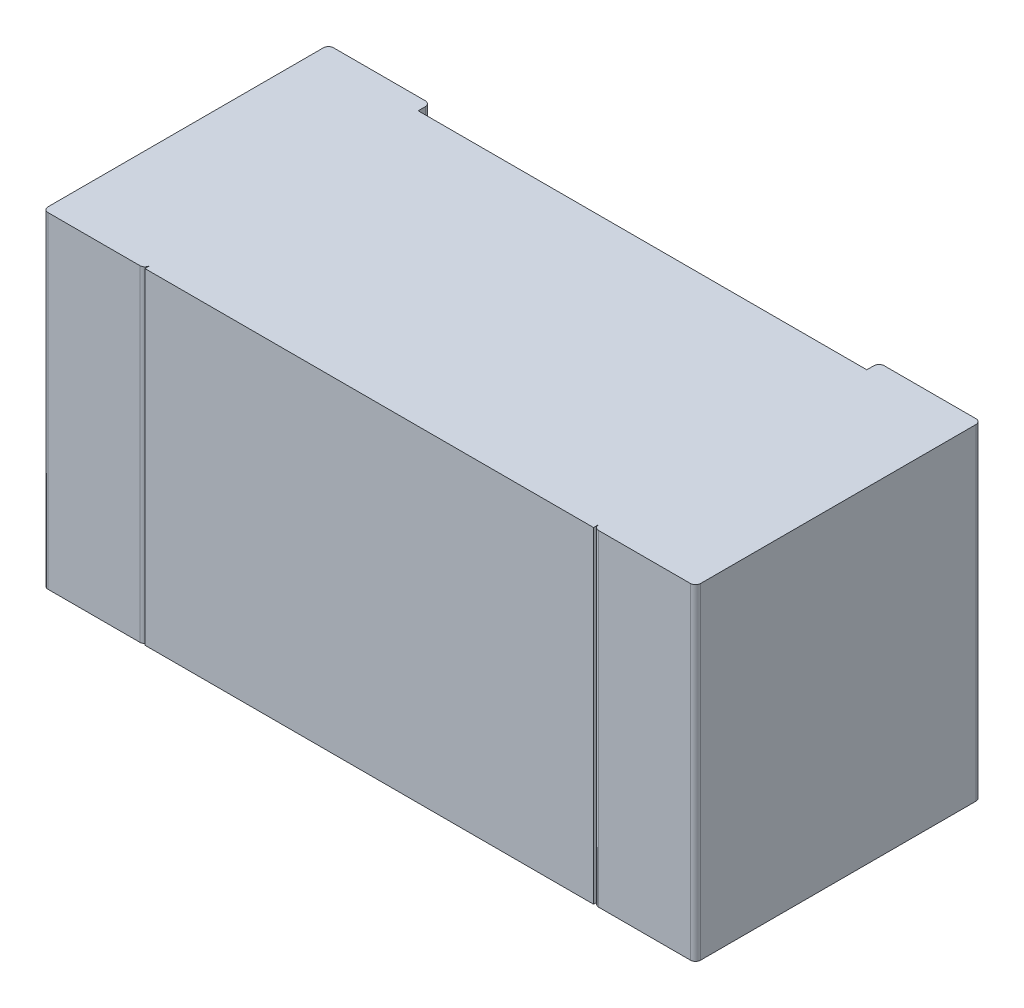
ISO-10303-21;
HEADER;
FILE_DESCRIPTION(('STEP AP214'),'2;1');
FILE_NAME('part.step','',(''),(''),'','','');
FILE_SCHEMA(('AUTOMOTIVE_DESIGN { 1 0 10303 214 1 1 1 1 }'));
ENDSEC;
DATA;
#1=APPLICATION_CONTEXT('core data for automotive mechanical design processes');
#2=APPLICATION_PROTOCOL_DEFINITION('international standard','automotive_design',2000,#1);
#3=PRODUCT_CONTEXT('',#1,'mechanical');
#4=PRODUCT('Part','Part','',(#3));
#5=PRODUCT_RELATED_PRODUCT_CATEGORY('part','',(#4));
#6=PRODUCT_DEFINITION_FORMATION('','',#4);
#7=PRODUCT_DEFINITION_CONTEXT('part definition',#1,'design');
#8=PRODUCT_DEFINITION('design','',#6,#7);
#9=PRODUCT_DEFINITION_SHAPE('','',#8);
#10=(LENGTH_UNIT() NAMED_UNIT(*) SI_UNIT(.MILLI.,.METRE.));
#11=(NAMED_UNIT(*) PLANE_ANGLE_UNIT() SI_UNIT($,.RADIAN.));
#12=(NAMED_UNIT(*) SI_UNIT($,.STERADIAN.) SOLID_ANGLE_UNIT());
#13=UNCERTAINTY_MEASURE_WITH_UNIT(LENGTH_MEASURE(1.E-05),#10,'distance_accuracy_value','');
#14=(GEOMETRIC_REPRESENTATION_CONTEXT(3) GLOBAL_UNCERTAINTY_ASSIGNED_CONTEXT((#13)) GLOBAL_UNIT_ASSIGNED_CONTEXT((#10,
#11,#12)) REPRESENTATION_CONTEXT('',''));
#15=CARTESIAN_POINT('',(0.,0.,0.));
#16=DIRECTION('',(0.,0.,1.));
#17=DIRECTION('',(1.,0.,0.));
#18=AXIS2_PLACEMENT_3D('',#15,#16,#17);
#19=CARTESIAN_POINT('',(-1.6,-0.8,1.4));
#20=DIRECTION('',(0.,0.,1.));
#21=DIRECTION('',(1.,0.,0.));
#22=AXIS2_PLACEMENT_3D('',#19,#20,#21);
#23=PLANE('',#22);
#24=DIRECTION('',(1.,0.,0.));
#25=VECTOR('',#24,1.);
#26=CARTESIAN_POINT('',(-1.6,-0.8,1.4));
#27=LINE('',#26,#25);
#28=CARTESIAN_POINT('',(-1.575,-0.8,1.4));
#29=VERTEX_POINT('',#28);
#30=CARTESIAN_POINT('',(-1.125,-0.8,1.4));
#31=VERTEX_POINT('',#30);
#32=EDGE_CURVE('E162',#29,#31,#27,.T.);
#33=ORIENTED_EDGE('',*,*,#32,.T.);
#34=DIRECTION('',(0.,1.,0.));
#35=VECTOR('',#34,1.);
#36=CARTESIAN_POINT('',(-1.125,-0.8,1.4));
#37=LINE('',#36,#35);
#38=CARTESIAN_POINT('',(-1.125,0.8,1.4));
#39=VERTEX_POINT('',#38);
#40=EDGE_CURVE('E161',#39,#31,#37,.F.);
#41=ORIENTED_EDGE('',*,*,#40,.F.);
#42=DIRECTION('',(1.,0.,0.));
#43=VECTOR('',#42,1.);
#44=CARTESIAN_POINT('',(-1.6,0.8,1.4));
#45=LINE('',#44,#43);
#46=CARTESIAN_POINT('',(-1.575,0.8,1.4));
#47=VERTEX_POINT('',#46);
#48=EDGE_CURVE('E157',#39,#47,#45,.F.);
#49=ORIENTED_EDGE('',*,*,#48,.T.);
#50=DIRECTION('',(0.,1.,0.));
#51=VECTOR('',#50,1.);
#52=CARTESIAN_POINT('',(-1.575,-0.8,1.4));
#53=LINE('',#52,#51);
#54=EDGE_CURVE('E193',#29,#47,#53,.T.);
#55=ORIENTED_EDGE('',*,*,#54,.F.);
#56=EDGE_LOOP('',(#33,#41,#49,#55));
#57=FACE_BOUND('',#56,.T.);
#58=ADVANCED_FACE('F17',(#57),#23,.T.);
#59=CARTESIAN_POINT('',(-1.125,-0.8,1.375));
#60=DIRECTION('',(0.,1.,0.));
#61=DIRECTION('',(0.,0.,1.));
#62=AXIS2_PLACEMENT_3D('',#59,#60,#61);
#63=CYLINDRICAL_SURFACE('',#62,0.025);
#64=ORIENTED_EDGE('',*,*,#40,.T.);
#65=CARTESIAN_POINT('',(-1.125,-0.8,1.375));
#66=DIRECTION('',(0.,1.,0.));
#67=DIRECTION('',(0.,0.,1.));
#68=AXIS2_PLACEMENT_3D('',#65,#66,#67);
#69=CIRCLE('',#68,0.025);
#70=CARTESIAN_POINT('',(-1.1,-0.8,1.375));
#71=VERTEX_POINT('',#70);
#72=EDGE_CURVE('E167',#31,#71,#69,.T.);
#73=ORIENTED_EDGE('',*,*,#72,.T.);
#74=DIRECTION('',(0.,1.,0.));
#75=VECTOR('',#74,1.);
#76=CARTESIAN_POINT('',(-1.1,-0.8,1.375));
#77=LINE('',#76,#75);
#78=CARTESIAN_POINT('',(-1.1,0.8,1.375));
#79=VERTEX_POINT('',#78);
#80=EDGE_CURVE('E164',#71,#79,#77,.T.);
#81=ORIENTED_EDGE('',*,*,#80,.T.);
#82=CARTESIAN_POINT('',(-1.125,0.8,1.375));
#83=DIRECTION('',(0.,1.,0.));
#84=DIRECTION('',(0.,0.,1.));
#85=AXIS2_PLACEMENT_3D('',#82,#83,#84);
#86=CIRCLE('',#85,0.025);
#87=EDGE_CURVE('E20',#79,#39,#86,.F.);
#88=ORIENTED_EDGE('',*,*,#87,.T.);
#89=EDGE_LOOP('',(#64,#73,#81,#88));
#90=FACE_BOUND('',#89,.T.);
#91=ADVANCED_FACE('F165',(#90),#63,.T.);
#92=CARTESIAN_POINT('',(1.125,-0.8,1.375));
#93=DIRECTION('',(0.,1.,0.));
#94=DIRECTION('',(0.,0.,1.));
#95=AXIS2_PLACEMENT_3D('',#92,#93,#94);
#96=CYLINDRICAL_SURFACE('',#95,0.025);
#97=CARTESIAN_POINT('',(1.125,0.8,1.375));
#98=DIRECTION('',(0.,1.,0.));
#99=DIRECTION('',(0.,0.,1.));
#100=AXIS2_PLACEMENT_3D('',#97,#98,#99);
#101=CIRCLE('',#100,0.025);
#102=CARTESIAN_POINT('',(1.125,0.8,1.4));
#103=VERTEX_POINT('',#102);
#104=CARTESIAN_POINT('',(1.1,0.8,1.375));
#105=VERTEX_POINT('',#104);
#106=EDGE_CURVE('E215',#103,#105,#101,.F.);
#107=ORIENTED_EDGE('',*,*,#106,.T.);
#108=DIRECTION('',(0.,1.,0.));
#109=VECTOR('',#108,1.);
#110=CARTESIAN_POINT('',(1.1,-0.8,1.375));
#111=LINE('',#110,#109);
#112=CARTESIAN_POINT('',(1.1,-0.8,1.375));
#113=VERTEX_POINT('',#112);
#114=EDGE_CURVE('E218',#113,#105,#111,.T.);
#115=ORIENTED_EDGE('',*,*,#114,.F.);
#116=CARTESIAN_POINT('',(1.125,-0.8,1.375));
#117=DIRECTION('',(0.,1.,0.));
#118=DIRECTION('',(0.,0.,1.));
#119=AXIS2_PLACEMENT_3D('',#116,#117,#118);
#120=CIRCLE('',#119,0.025);
#121=CARTESIAN_POINT('',(1.125,-0.8,1.4));
#122=VERTEX_POINT('',#121);
#123=EDGE_CURVE('E262',#113,#122,#120,.T.);
#124=ORIENTED_EDGE('',*,*,#123,.T.);
#125=DIRECTION('',(0.,1.,0.));
#126=VECTOR('',#125,1.);
#127=CARTESIAN_POINT('',(1.125,-0.8,1.4));
#128=LINE('',#127,#126);
#129=EDGE_CURVE('E214',#103,#122,#128,.F.);
#130=ORIENTED_EDGE('',*,*,#129,.F.);
#131=EDGE_LOOP('',(#107,#115,#124,#130));
#132=FACE_BOUND('',#131,.T.);
#133=ADVANCED_FACE('F267',(#132),#96,.T.);
#134=CARTESIAN_POINT('',(1.1,-0.8,1.4));
#135=DIRECTION('',(0.,0.,1.));
#136=DIRECTION('',(1.,0.,0.));
#137=AXIS2_PLACEMENT_3D('',#134,#135,#136);
#138=PLANE('',#137);
#139=DIRECTION('',(1.,0.,0.));
#140=VECTOR('',#139,1.);
#141=CARTESIAN_POINT('',(1.1,-0.8,1.4));
#142=LINE('',#141,#140);
#143=CARTESIAN_POINT('',(1.575,-0.8,1.4));
#144=VERTEX_POINT('',#143);
#145=EDGE_CURVE('E209',#122,#144,#142,.T.);
#146=ORIENTED_EDGE('',*,*,#145,.T.);
#147=DIRECTION('',(0.,1.,0.));
#148=VECTOR('',#147,1.);
#149=CARTESIAN_POINT('',(1.575,-0.8,1.4));
#150=LINE('',#149,#148);
#151=CARTESIAN_POINT('',(1.575,0.8,1.4));
#152=VERTEX_POINT('',#151);
#153=EDGE_CURVE('E255',#152,#144,#150,.F.);
#154=ORIENTED_EDGE('',*,*,#153,.F.);
#155=DIRECTION('',(1.,0.,0.));
#156=VECTOR('',#155,1.);
#157=CARTESIAN_POINT('',(1.1,0.8,1.4));
#158=LINE('',#157,#156);
#159=EDGE_CURVE('E212',#152,#103,#158,.F.);
#160=ORIENTED_EDGE('',*,*,#159,.T.);
#161=ORIENTED_EDGE('',*,*,#129,.T.);
#162=EDGE_LOOP('',(#146,#154,#160,#161));
#163=FACE_BOUND('',#162,.T.);
#164=ADVANCED_FACE('F271',(#163),#138,.T.);
#165=CARTESIAN_POINT('',(-1.6,-0.8,0.));
#166=DIRECTION('',(0.,0.,1.));
#167=DIRECTION('',(1.,0.,0.));
#168=AXIS2_PLACEMENT_3D('',#165,#166,#167);
#169=PLANE('',#168);
#170=DIRECTION('',(1.,0.,0.));
#171=VECTOR('',#170,1.);
#172=CARTESIAN_POINT('',(-1.6,-0.8,0.));
#173=LINE('',#172,#171);
#174=CARTESIAN_POINT('',(-1.575,-0.8,0.));
#175=VERTEX_POINT('',#174);
#176=CARTESIAN_POINT('',(-1.125,-0.8,0.));
#177=VERTEX_POINT('',#176);
#178=EDGE_CURVE('E204',#175,#177,#173,.T.);
#179=ORIENTED_EDGE('',*,*,#178,.F.);
#180=DIRECTION('',(0.,1.,0.));
#181=VECTOR('',#180,1.);
#182=CARTESIAN_POINT('',(-1.575,-0.8,0.));
#183=LINE('',#182,#181);
#184=CARTESIAN_POINT('',(-1.575,0.8,0.));
#185=VERTEX_POINT('',#184);
#186=EDGE_CURVE('E197',#185,#175,#183,.F.);
#187=ORIENTED_EDGE('',*,*,#186,.F.);
#188=DIRECTION('',(1.,0.,0.));
#189=VECTOR('',#188,1.);
#190=CARTESIAN_POINT('',(-1.6,0.8,0.));
#191=LINE('',#190,#189);
#192=CARTESIAN_POINT('',(-1.125,0.8,0.));
#193=VERTEX_POINT('',#192);
#194=EDGE_CURVE('E207',#193,#185,#191,.F.);
#195=ORIENTED_EDGE('',*,*,#194,.F.);
#196=DIRECTION('',(0.,1.,0.));
#197=VECTOR('',#196,1.);
#198=CARTESIAN_POINT('',(-1.125,-0.8,0.));
#199=LINE('',#198,#197);
#200=EDGE_CURVE('E188',#177,#193,#199,.T.);
#201=ORIENTED_EDGE('',*,*,#200,.F.);
#202=EDGE_LOOP('',(#179,#187,#195,#201));
#203=FACE_BOUND('',#202,.T.);
#204=ADVANCED_FACE('F442',(#203),#169,.F.);
#205=CARTESIAN_POINT('',(1.1,-0.8,0.));
#206=DIRECTION('',(0.,0.,1.));
#207=DIRECTION('',(1.,0.,0.));
#208=AXIS2_PLACEMENT_3D('',#205,#206,#207);
#209=PLANE('',#208);
#210=DIRECTION('',(1.,0.,0.));
#211=VECTOR('',#210,1.);
#212=CARTESIAN_POINT('',(1.1,-0.8,0.));
#213=LINE('',#212,#211);
#214=CARTESIAN_POINT('',(1.125,-0.8,0.));
#215=VERTEX_POINT('',#214);
#216=CARTESIAN_POINT('',(1.575,-0.8,0.));
#217=VERTEX_POINT('',#216);
#218=EDGE_CURVE('E201',#215,#217,#213,.T.);
#219=ORIENTED_EDGE('',*,*,#218,.F.);
#220=DIRECTION('',(0.,1.,0.));
#221=VECTOR('',#220,1.);
#222=CARTESIAN_POINT('',(1.125,-0.8,0.));
#223=LINE('',#222,#221);
#224=CARTESIAN_POINT('',(1.125,0.8,0.));
#225=VERTEX_POINT('',#224);
#226=EDGE_CURVE('E191',#225,#215,#223,.F.);
#227=ORIENTED_EDGE('',*,*,#226,.F.);
#228=DIRECTION('',(1.,0.,0.));
#229=VECTOR('',#228,1.);
#230=CARTESIAN_POINT('',(1.1,0.8,0.));
#231=LINE('',#230,#229);
#232=CARTESIAN_POINT('',(1.575,0.8,0.));
#233=VERTEX_POINT('',#232);
#234=EDGE_CURVE('E202',#233,#225,#231,.F.);
#235=ORIENTED_EDGE('',*,*,#234,.F.);
#236=DIRECTION('',(0.,1.,0.));
#237=VECTOR('',#236,1.);
#238=CARTESIAN_POINT('',(1.575,-0.8,0.));
#239=LINE('',#238,#237);
#240=EDGE_CURVE('E258',#217,#233,#239,.T.);
#241=ORIENTED_EDGE('',*,*,#240,.F.);
#242=EDGE_LOOP('',(#219,#227,#235,#241));
#243=FACE_BOUND('',#242,.T.);
#244=ADVANCED_FACE('F397',(#243),#209,.F.);
#245=CARTESIAN_POINT('',(-1.575,-0.8,0.025));
#246=DIRECTION('',(0.,1.,0.));
#247=DIRECTION('',(0.,0.,1.));
#248=AXIS2_PLACEMENT_3D('',#245,#246,#247);
#249=CYLINDRICAL_SURFACE('',#248,0.025);
#250=ORIENTED_EDGE('',*,*,#186,.T.);
#251=CARTESIAN_POINT('',(-1.575,-0.8,0.025));
#252=DIRECTION('',(0.,1.,0.));
#253=DIRECTION('',(0.,0.,1.));
#254=AXIS2_PLACEMENT_3D('',#251,#252,#253);
#255=CIRCLE('',#254,0.025);
#256=CARTESIAN_POINT('',(-1.6,-0.8,0.025));
#257=VERTEX_POINT('',#256);
#258=EDGE_CURVE('E200',#175,#257,#255,.T.);
#259=ORIENTED_EDGE('',*,*,#258,.T.);
#260=DIRECTION('',(0.,1.,0.));
#261=VECTOR('',#260,1.);
#262=CARTESIAN_POINT('',(-1.6,-0.8,0.025));
#263=LINE('',#262,#261);
#264=CARTESIAN_POINT('',(-1.6,0.8,0.025));
#265=VERTEX_POINT('',#264);
#266=EDGE_CURVE('E243',#257,#265,#263,.T.);
#267=ORIENTED_EDGE('',*,*,#266,.T.);
#268=CARTESIAN_POINT('',(-1.575,0.8,0.025));
#269=DIRECTION('',(0.,1.,0.));
#270=DIRECTION('',(0.,0.,1.));
#271=AXIS2_PLACEMENT_3D('',#268,#269,#270);
#272=CIRCLE('',#271,0.025);
#273=EDGE_CURVE('E248',#185,#265,#272,.T.);
#274=ORIENTED_EDGE('',*,*,#273,.F.);
#275=EDGE_LOOP('',(#250,#259,#267,#274));
#276=FACE_BOUND('',#275,.T.);
#277=ADVANCED_FACE('F368',(#276),#249,.T.);
#278=CARTESIAN_POINT('',(-1.575,-0.8,1.375));
#279=DIRECTION('',(0.,1.,0.));
#280=DIRECTION('',(0.,0.,1.));
#281=AXIS2_PLACEMENT_3D('',#278,#279,#280);
#282=CYLINDRICAL_SURFACE('',#281,0.025);
#283=CARTESIAN_POINT('',(-1.575,0.8,1.375));
#284=DIRECTION('',(0.,1.,0.));
#285=DIRECTION('',(0.,0.,1.));
#286=AXIS2_PLACEMENT_3D('',#283,#284,#285);
#287=CIRCLE('',#286,0.025);
#288=CARTESIAN_POINT('',(-1.6,0.8,1.375));
#289=VERTEX_POINT('',#288);
#290=EDGE_CURVE('E184',#289,#47,#287,.T.);
#291=ORIENTED_EDGE('',*,*,#290,.F.);
#292=DIRECTION('',(0.,1.,0.));
#293=VECTOR('',#292,1.);
#294=CARTESIAN_POINT('',(-1.6,-0.8,1.375));
#295=LINE('',#294,#293);
#296=CARTESIAN_POINT('',(-1.6,-0.8,1.375));
#297=VERTEX_POINT('',#296);
#298=EDGE_CURVE('E232',#289,#297,#295,.F.);
#299=ORIENTED_EDGE('',*,*,#298,.T.);
#300=CARTESIAN_POINT('',(-1.575,-0.8,1.375));
#301=DIRECTION('',(0.,1.,0.));
#302=DIRECTION('',(0.,0.,1.));
#303=AXIS2_PLACEMENT_3D('',#300,#301,#302);
#304=CIRCLE('',#303,0.025);
#305=EDGE_CURVE('E196',#297,#29,#304,.T.);
#306=ORIENTED_EDGE('',*,*,#305,.T.);
#307=ORIENTED_EDGE('',*,*,#54,.T.);
#308=EDGE_LOOP('',(#291,#299,#306,#307));
#309=FACE_BOUND('',#308,.T.);
#310=ADVANCED_FACE('F359',(#309),#282,.T.);
#311=CARTESIAN_POINT('',(-1.1,-0.8,1.34));
#312=DIRECTION('',(1.,0.,0.));
#313=DIRECTION('',(0.,0.,-1.));
#314=AXIS2_PLACEMENT_3D('',#311,#312,#313);
#315=PLANE('',#314);
#316=DIRECTION('',(0.,0.,1.));
#317=VECTOR('',#316,1.);
#318=CARTESIAN_POINT('',(-1.1,0.8,1.34));
#319=LINE('',#318,#317);
#320=CARTESIAN_POINT('',(-1.1,0.8,1.4));
#321=VERTEX_POINT('',#320);
#322=EDGE_CURVE('E154',#79,#321,#319,.T.);
#323=ORIENTED_EDGE('',*,*,#322,.F.);
#324=ORIENTED_EDGE('',*,*,#80,.F.);
#325=DIRECTION('',(0.,0.,-1.));
#326=VECTOR('',#325,1.);
#327=CARTESIAN_POINT('',(-1.1,-0.8,1.34));
#328=LINE('',#327,#326);
#329=CARTESIAN_POINT('',(-1.1,-0.8,1.4));
#330=VERTEX_POINT('',#329);
#331=EDGE_CURVE('E171',#330,#71,#328,.T.);
#332=ORIENTED_EDGE('',*,*,#331,.F.);
#333=DIRECTION('',(0.,1.,0.));
#334=VECTOR('',#333,1.);
#335=CARTESIAN_POINT('',(-1.1,-0.8,1.4));
#336=LINE('',#335,#334);
#337=EDGE_CURVE('E176',#321,#330,#336,.F.);
#338=ORIENTED_EDGE('',*,*,#337,.F.);
#339=EDGE_LOOP('',(#323,#324,#332,#338));
#340=FACE_BOUND('',#339,.T.);
#341=ADVANCED_FACE('F174',(#340),#315,.F.);
#342=CARTESIAN_POINT('',(1.1,-0.8,1.34));
#343=DIRECTION('',(1.,0.,0.));
#344=DIRECTION('',(0.,0.,-1.));
#345=AXIS2_PLACEMENT_3D('',#342,#343,#344);
#346=PLANE('',#345);
#347=DIRECTION('',(0.,0.,1.));
#348=VECTOR('',#347,1.);
#349=CARTESIAN_POINT('',(1.1,0.8,1.34));
#350=LINE('',#349,#348);
#351=CARTESIAN_POINT('',(1.1,0.8,1.4));
#352=VERTEX_POINT('',#351);
#353=EDGE_CURVE('E177',#352,#105,#350,.F.);
#354=ORIENTED_EDGE('',*,*,#353,.F.);
#355=DIRECTION('',(0.,1.,0.));
#356=VECTOR('',#355,1.);
#357=CARTESIAN_POINT('',(1.1,-0.8,1.4));
#358=LINE('',#357,#356);
#359=CARTESIAN_POINT('',(1.1,-0.8,1.4));
#360=VERTEX_POINT('',#359);
#361=EDGE_CURVE('E231',#360,#352,#358,.T.);
#362=ORIENTED_EDGE('',*,*,#361,.F.);
#363=DIRECTION('',(0.,0.,-1.));
#364=VECTOR('',#363,1.);
#365=CARTESIAN_POINT('',(1.1,-0.8,1.34));
#366=LINE('',#365,#364);
#367=EDGE_CURVE('E170',#360,#113,#366,.T.);
#368=ORIENTED_EDGE('',*,*,#367,.T.);
#369=ORIENTED_EDGE('',*,*,#114,.T.);
#370=EDGE_LOOP('',(#354,#362,#368,#369));
#371=FACE_BOUND('',#370,.T.);
#372=ADVANCED_FACE('F353',(#371),#346,.T.);
#373=CARTESIAN_POINT('',(1.575,-0.8,0.025));
#374=DIRECTION('',(0.,1.,0.));
#375=DIRECTION('',(0.,0.,1.));
#376=AXIS2_PLACEMENT_3D('',#373,#374,#375);
#377=CYLINDRICAL_SURFACE('',#376,0.025);
#378=CARTESIAN_POINT('',(1.575,0.8,0.025));
#379=DIRECTION('',(0.,1.,0.));
#380=DIRECTION('',(0.,0.,1.));
#381=AXIS2_PLACEMENT_3D('',#378,#379,#380);
#382=CIRCLE('',#381,0.025);
#383=CARTESIAN_POINT('',(1.6,0.8,0.025));
#384=VERTEX_POINT('',#383);
#385=EDGE_CURVE('E240',#384,#233,#382,.T.);
#386=ORIENTED_EDGE('',*,*,#385,.F.);
#387=DIRECTION('',(0.,1.,0.));
#388=VECTOR('',#387,1.);
#389=CARTESIAN_POINT('',(1.6,-0.8,0.025));
#390=LINE('',#389,#388);
#391=CARTESIAN_POINT('',(1.6,-0.8,0.025));
#392=VERTEX_POINT('',#391);
#393=EDGE_CURVE('E295',#392,#384,#390,.T.);
#394=ORIENTED_EDGE('',*,*,#393,.F.);
#395=CARTESIAN_POINT('',(1.575,-0.8,0.025));
#396=DIRECTION('',(0.,1.,0.));
#397=DIRECTION('',(0.,0.,1.));
#398=AXIS2_PLACEMENT_3D('',#395,#396,#397);
#399=CIRCLE('',#398,0.025);
#400=EDGE_CURVE('E256',#392,#217,#399,.T.);
#401=ORIENTED_EDGE('',*,*,#400,.T.);
#402=ORIENTED_EDGE('',*,*,#240,.T.);
#403=EDGE_LOOP('',(#386,#394,#401,#402));
#404=FACE_BOUND('',#403,.T.);
#405=ADVANCED_FACE('F402',(#404),#377,.T.);
#406=CARTESIAN_POINT('',(1.575,-0.8,1.375));
#407=DIRECTION('',(0.,1.,0.));
#408=DIRECTION('',(0.,0.,1.));
#409=AXIS2_PLACEMENT_3D('',#406,#407,#408);
#410=CYLINDRICAL_SURFACE('',#409,0.025);
#411=ORIENTED_EDGE('',*,*,#153,.T.);
#412=CARTESIAN_POINT('',(1.575,-0.8,1.375));
#413=DIRECTION('',(0.,1.,0.));
#414=DIRECTION('',(0.,0.,1.));
#415=AXIS2_PLACEMENT_3D('',#412,#413,#414);
#416=CIRCLE('',#415,0.025);
#417=CARTESIAN_POINT('',(1.6,-0.8,1.375));
#418=VERTEX_POINT('',#417);
#419=EDGE_CURVE('E253',#144,#418,#416,.T.);
#420=ORIENTED_EDGE('',*,*,#419,.T.);
#421=DIRECTION('',(0.,1.,0.));
#422=VECTOR('',#421,1.);
#423=CARTESIAN_POINT('',(1.6,-0.8,1.375));
#424=LINE('',#423,#422);
#425=CARTESIAN_POINT('',(1.6,0.8,1.375));
#426=VERTEX_POINT('',#425);
#427=EDGE_CURVE('E285',#426,#418,#424,.F.);
#428=ORIENTED_EDGE('',*,*,#427,.F.);
#429=CARTESIAN_POINT('',(1.575,0.8,1.375));
#430=DIRECTION('',(0.,1.,0.));
#431=DIRECTION('',(0.,0.,1.));
#432=AXIS2_PLACEMENT_3D('',#429,#430,#431);
#433=CIRCLE('',#432,0.025);
#434=EDGE_CURVE('E244',#152,#426,#433,.T.);
#435=ORIENTED_EDGE('',*,*,#434,.F.);
#436=EDGE_LOOP('',(#411,#420,#428,#435));
#437=FACE_BOUND('',#436,.T.);
#438=ADVANCED_FACE('F283',(#437),#410,.T.);
#439=CARTESIAN_POINT('',(-1.125,-0.8,0.025));
#440=DIRECTION('',(0.,1.,0.));
#441=DIRECTION('',(0.,0.,1.));
#442=AXIS2_PLACEMENT_3D('',#439,#440,#441);
#443=CYLINDRICAL_SURFACE('',#442,0.025);
#444=CARTESIAN_POINT('',(-1.125,0.8,0.025));
#445=DIRECTION('',(0.,1.,0.));
#446=DIRECTION('',(0.,0.,1.));
#447=AXIS2_PLACEMENT_3D('',#444,#445,#446);
#448=CIRCLE('',#447,0.025);
#449=CARTESIAN_POINT('',(-1.1,0.8,0.025));
#450=VERTEX_POINT('',#449);
#451=EDGE_CURVE('E178',#450,#193,#448,.T.);
#452=ORIENTED_EDGE('',*,*,#451,.F.);
#453=DIRECTION('',(0.,1.,0.));
#454=VECTOR('',#453,1.);
#455=CARTESIAN_POINT('',(-1.1,-0.8,0.025));
#456=LINE('',#455,#454);
#457=CARTESIAN_POINT('',(-1.1,-0.8,0.025));
#458=VERTEX_POINT('',#457);
#459=EDGE_CURVE('E291',#458,#450,#456,.T.);
#460=ORIENTED_EDGE('',*,*,#459,.F.);
#461=CARTESIAN_POINT('',(-1.125,-0.8,0.025));
#462=DIRECTION('',(0.,1.,0.));
#463=DIRECTION('',(0.,0.,1.));
#464=AXIS2_PLACEMENT_3D('',#461,#462,#463);
#465=CIRCLE('',#464,0.025);
#466=EDGE_CURVE('E192',#458,#177,#465,.T.);
#467=ORIENTED_EDGE('',*,*,#466,.T.);
#468=ORIENTED_EDGE('',*,*,#200,.T.);
#469=EDGE_LOOP('',(#452,#460,#467,#468));
#470=FACE_BOUND('',#469,.T.);
#471=ADVANCED_FACE('F410',(#470),#443,.T.);
#472=CARTESIAN_POINT('',(1.125,-0.8,0.025));
#473=DIRECTION('',(0.,1.,0.));
#474=DIRECTION('',(0.,0.,1.));
#475=AXIS2_PLACEMENT_3D('',#472,#473,#474);
#476=CYLINDRICAL_SURFACE('',#475,0.025);
#477=ORIENTED_EDGE('',*,*,#226,.T.);
#478=CARTESIAN_POINT('',(1.125,-0.8,0.025));
#479=DIRECTION('',(0.,1.,0.));
#480=DIRECTION('',(0.,0.,1.));
#481=AXIS2_PLACEMENT_3D('',#478,#479,#480);
#482=CIRCLE('',#481,0.025);
#483=CARTESIAN_POINT('',(1.1,-0.8,0.025));
#484=VERTEX_POINT('',#483);
#485=EDGE_CURVE('E250',#215,#484,#482,.T.);
#486=ORIENTED_EDGE('',*,*,#485,.T.);
#487=DIRECTION('',(0.,1.,0.));
#488=VECTOR('',#487,1.);
#489=CARTESIAN_POINT('',(1.1,-0.8,0.025));
#490=LINE('',#489,#488);
#491=CARTESIAN_POINT('',(1.1,0.8,0.025));
#492=VERTEX_POINT('',#491);
#493=EDGE_CURVE('E303',#484,#492,#490,.T.);
#494=ORIENTED_EDGE('',*,*,#493,.T.);
#495=CARTESIAN_POINT('',(1.125,0.8,0.025));
#496=DIRECTION('',(0.,1.,0.));
#497=DIRECTION('',(0.,0.,1.));
#498=AXIS2_PLACEMENT_3D('',#495,#496,#497);
#499=CIRCLE('',#498,0.025);
#500=EDGE_CURVE('E181',#225,#492,#499,.T.);
#501=ORIENTED_EDGE('',*,*,#500,.F.);
#502=EDGE_LOOP('',(#477,#486,#494,#501));
#503=FACE_BOUND('',#502,.T.);
#504=ADVANCED_FACE('F394',(#503),#476,.T.);
#505=CARTESIAN_POINT('',(-1.6,-0.8,0.));
#506=DIRECTION('',(1.,0.,0.));
#507=DIRECTION('',(0.,0.,-1.));
#508=AXIS2_PLACEMENT_3D('',#505,#506,#507);
#509=PLANE('',#508);
#510=DIRECTION('',(0.,0.,-1.));
#511=VECTOR('',#510,1.);
#512=CARTESIAN_POINT('',(-1.6,0.8,0.));
#513=LINE('',#512,#511);
#514=EDGE_CURVE('E320',#265,#289,#513,.F.);
#515=ORIENTED_EDGE('',*,*,#514,.F.);
#516=ORIENTED_EDGE('',*,*,#266,.F.);
#517=DIRECTION('',(0.,0.,1.));
#518=VECTOR('',#517,1.);
#519=CARTESIAN_POINT('',(-1.6,-0.8,0.));
#520=LINE('',#519,#518);
#521=EDGE_CURVE('E299',#257,#297,#520,.T.);
#522=ORIENTED_EDGE('',*,*,#521,.T.);
#523=ORIENTED_EDGE('',*,*,#298,.F.);
#524=EDGE_LOOP('',(#515,#516,#522,#523));
#525=FACE_BOUND('',#524,.T.);
#526=ADVANCED_FACE('F365',(#525),#509,.F.);
#527=CARTESIAN_POINT('',(-1.1,-0.8,1.4));
#528=DIRECTION('',(0.,0.,1.));
#529=DIRECTION('',(1.,0.,0.));
#530=AXIS2_PLACEMENT_3D('',#527,#528,#529);
#531=PLANE('',#530);
#532=ORIENTED_EDGE('',*,*,#361,.T.);
#533=DIRECTION('',(1.,0.,0.));
#534=VECTOR('',#533,1.);
#535=CARTESIAN_POINT('',(-1.1,0.8,1.4));
#536=LINE('',#535,#534);
#537=EDGE_CURVE('E302',#352,#321,#536,.F.);
#538=ORIENTED_EDGE('',*,*,#537,.T.);
#539=ORIENTED_EDGE('',*,*,#337,.T.);
#540=DIRECTION('',(1.,0.,0.));
#541=VECTOR('',#540,1.);
#542=CARTESIAN_POINT('',(-1.1,-0.8,1.4));
#543=LINE('',#542,#541);
#544=EDGE_CURVE('E221',#330,#360,#543,.T.);
#545=ORIENTED_EDGE('',*,*,#544,.T.);
#546=EDGE_LOOP('',(#532,#538,#539,#545));
#547=FACE_BOUND('',#546,.T.);
#548=ADVANCED_FACE('F348',(#547),#531,.T.);
#549=CARTESIAN_POINT('',(1.6,-0.8,0.));
#550=DIRECTION('',(1.,0.,0.));
#551=DIRECTION('',(0.,0.,-1.));
#552=AXIS2_PLACEMENT_3D('',#549,#550,#551);
#553=PLANE('',#552);
#554=DIRECTION('',(0.,0.,-1.));
#555=VECTOR('',#554,1.);
#556=CARTESIAN_POINT('',(1.6,0.8,0.));
#557=LINE('',#556,#555);
#558=EDGE_CURVE('E290',#384,#426,#557,.F.);
#559=ORIENTED_EDGE('',*,*,#558,.T.);
#560=ORIENTED_EDGE('',*,*,#427,.T.);
#561=DIRECTION('',(0.,0.,1.));
#562=VECTOR('',#561,1.);
#563=CARTESIAN_POINT('',(1.6,-0.8,0.));
#564=LINE('',#563,#562);
#565=EDGE_CURVE('E279',#418,#392,#564,.F.);
#566=ORIENTED_EDGE('',*,*,#565,.T.);
#567=ORIENTED_EDGE('',*,*,#393,.T.);
#568=EDGE_LOOP('',(#559,#560,#566,#567));
#569=FACE_BOUND('',#568,.T.);
#570=ADVANCED_FACE('F288',(#569),#553,.T.);
#571=CARTESIAN_POINT('',(-1.1,-0.8,0.));
#572=DIRECTION('',(1.,0.,0.));
#573=DIRECTION('',(0.,0.,-1.));
#574=AXIS2_PLACEMENT_3D('',#571,#572,#573);
#575=PLANE('',#574);
#576=DIRECTION('',(0.,0.,-1.));
#577=VECTOR('',#576,1.);
#578=CARTESIAN_POINT('',(-1.1,0.8,0.));
#579=LINE('',#578,#577);
#580=CARTESIAN_POINT('',(-1.1,0.8,0.06));
#581=VERTEX_POINT('',#580);
#582=EDGE_CURVE('E293',#450,#581,#579,.F.);
#583=ORIENTED_EDGE('',*,*,#582,.T.);
#584=DIRECTION('',(0.,1.,0.));
#585=VECTOR('',#584,1.);
#586=CARTESIAN_POINT('',(-1.1,-0.8,0.06));
#587=LINE('',#586,#585);
#588=CARTESIAN_POINT('',(-1.1,-0.8,0.06));
#589=VERTEX_POINT('',#588);
#590=EDGE_CURVE('E312',#581,#589,#587,.F.);
#591=ORIENTED_EDGE('',*,*,#590,.T.);
#592=DIRECTION('',(0.,0.,1.));
#593=VECTOR('',#592,1.);
#594=CARTESIAN_POINT('',(-1.1,-0.8,0.));
#595=LINE('',#594,#593);
#596=EDGE_CURVE('E35',#589,#458,#595,.F.);
#597=ORIENTED_EDGE('',*,*,#596,.T.);
#598=ORIENTED_EDGE('',*,*,#459,.T.);
#599=EDGE_LOOP('',(#583,#591,#597,#598));
#600=FACE_BOUND('',#599,.T.);
#601=ADVANCED_FACE('F424',(#600),#575,.T.);
#602=CARTESIAN_POINT('',(1.1,-0.8,0.));
#603=DIRECTION('',(1.,0.,0.));
#604=DIRECTION('',(0.,0.,-1.));
#605=AXIS2_PLACEMENT_3D('',#602,#603,#604);
#606=PLANE('',#605);
#607=DIRECTION('',(0.,0.,-1.));
#608=VECTOR('',#607,1.);
#609=CARTESIAN_POINT('',(1.1,0.8,0.));
#610=LINE('',#609,#608);
#611=CARTESIAN_POINT('',(1.1,0.8,0.06));
#612=VERTEX_POINT('',#611);
#613=EDGE_CURVE('E305',#492,#612,#610,.F.);
#614=ORIENTED_EDGE('',*,*,#613,.F.);
#615=ORIENTED_EDGE('',*,*,#493,.F.);
#616=DIRECTION('',(0.,0.,1.));
#617=VECTOR('',#616,1.);
#618=CARTESIAN_POINT('',(1.1,-0.8,0.));
#619=LINE('',#618,#617);
#620=CARTESIAN_POINT('',(1.1,-0.8,0.06));
#621=VERTEX_POINT('',#620);
#622=EDGE_CURVE('E224',#484,#621,#619,.T.);
#623=ORIENTED_EDGE('',*,*,#622,.T.);
#624=DIRECTION('',(0.,1.,0.));
#625=VECTOR('',#624,1.);
#626=CARTESIAN_POINT('',(1.1,-0.8,0.06));
#627=LINE('',#626,#625);
#628=EDGE_CURVE('E309',#621,#612,#627,.T.);
#629=ORIENTED_EDGE('',*,*,#628,.T.);
#630=EDGE_LOOP('',(#614,#615,#623,#629));
#631=FACE_BOUND('',#630,.T.);
#632=ADVANCED_FACE('F384',(#631),#606,.F.);
#633=CARTESIAN_POINT('',(-1.54,0.8,0.06));
#634=DIRECTION('',(0.,1.,0.));
#635=DIRECTION('',(0.,0.,1.));
#636=AXIS2_PLACEMENT_3D('',#633,#634,#635);
#637=PLANE('',#636);
#638=ORIENTED_EDGE('',*,*,#87,.F.);
#639=ORIENTED_EDGE('',*,*,#322,.T.);
#640=ORIENTED_EDGE('',*,*,#537,.F.);
#641=ORIENTED_EDGE('',*,*,#353,.T.);
#642=ORIENTED_EDGE('',*,*,#106,.F.);
#643=ORIENTED_EDGE('',*,*,#159,.F.);
#644=ORIENTED_EDGE('',*,*,#434,.T.);
#645=ORIENTED_EDGE('',*,*,#558,.F.);
#646=ORIENTED_EDGE('',*,*,#385,.T.);
#647=ORIENTED_EDGE('',*,*,#234,.T.);
#648=ORIENTED_EDGE('',*,*,#500,.T.);
#649=ORIENTED_EDGE('',*,*,#613,.T.);
#650=DIRECTION('',(1.,0.,0.));
#651=VECTOR('',#650,1.);
#652=CARTESIAN_POINT('',(-1.54,0.8,0.06));
#653=LINE('',#652,#651);
#654=EDGE_CURVE('E26',#612,#581,#653,.F.);
#655=ORIENTED_EDGE('',*,*,#654,.T.);
#656=ORIENTED_EDGE('',*,*,#582,.F.);
#657=ORIENTED_EDGE('',*,*,#451,.T.);
#658=ORIENTED_EDGE('',*,*,#194,.T.);
#659=ORIENTED_EDGE('',*,*,#273,.T.);
#660=ORIENTED_EDGE('',*,*,#514,.T.);
#661=ORIENTED_EDGE('',*,*,#290,.T.);
#662=ORIENTED_EDGE('',*,*,#48,.F.);
#663=EDGE_LOOP('',(#638,#639,#640,#641,#642,#643,#644,#645,#646,#647,#648,#649,#655,#656,#657,
#658,#659,#660,#661,#662));
#664=FACE_BOUND('',#663,.T.);
#665=ADVANCED_FACE('F151',(#664),#637,.T.);
#666=CARTESIAN_POINT('',(-1.54,-0.8,0.06));
#667=DIRECTION('',(0.,0.,1.));
#668=DIRECTION('',(1.,0.,0.));
#669=AXIS2_PLACEMENT_3D('',#666,#667,#668);
#670=PLANE('',#669);
#671=ORIENTED_EDGE('',*,*,#628,.F.);
#672=DIRECTION('',(1.,0.,0.));
#673=VECTOR('',#672,1.);
#674=CARTESIAN_POINT('',(-1.54,-0.8,0.06));
#675=LINE('',#674,#673);
#676=EDGE_CURVE('E11',#621,#589,#675,.F.);
#677=ORIENTED_EDGE('',*,*,#676,.T.);
#678=ORIENTED_EDGE('',*,*,#590,.F.);
#679=ORIENTED_EDGE('',*,*,#654,.F.);
#680=EDGE_LOOP('',(#671,#677,#678,#679));
#681=FACE_BOUND('',#680,.T.);
#682=ADVANCED_FACE('F390',(#681),#670,.F.);
#683=CARTESIAN_POINT('',(-1.54,-0.8,0.06));
#684=DIRECTION('',(0.,1.,0.));
#685=DIRECTION('',(0.,0.,1.));
#686=AXIS2_PLACEMENT_3D('',#683,#684,#685);
#687=PLANE('',#686);
#688=ORIENTED_EDGE('',*,*,#331,.T.);
#689=ORIENTED_EDGE('',*,*,#72,.F.);
#690=ORIENTED_EDGE('',*,*,#32,.F.);
#691=ORIENTED_EDGE('',*,*,#305,.F.);
#692=ORIENTED_EDGE('',*,*,#521,.F.);
#693=ORIENTED_EDGE('',*,*,#258,.F.);
#694=ORIENTED_EDGE('',*,*,#178,.T.);
#695=ORIENTED_EDGE('',*,*,#466,.F.);
#696=ORIENTED_EDGE('',*,*,#596,.F.);
#697=ORIENTED_EDGE('',*,*,#676,.F.);
#698=ORIENTED_EDGE('',*,*,#622,.F.);
#699=ORIENTED_EDGE('',*,*,#485,.F.);
#700=ORIENTED_EDGE('',*,*,#218,.T.);
#701=ORIENTED_EDGE('',*,*,#400,.F.);
#702=ORIENTED_EDGE('',*,*,#565,.F.);
#703=ORIENTED_EDGE('',*,*,#419,.F.);
#704=ORIENTED_EDGE('',*,*,#145,.F.);
#705=ORIENTED_EDGE('',*,*,#123,.F.);
#706=ORIENTED_EDGE('',*,*,#367,.F.);
#707=ORIENTED_EDGE('',*,*,#544,.F.);
#708=EDGE_LOOP('',(#688,#689,#690,#691,#692,#693,#694,#695,#696,#697,#698,#699,#700,#701,#702,
#703,#704,#705,#706,#707));
#709=FACE_BOUND('',#708,.T.);
#710=ADVANCED_FACE('F276',(#709),#687,.F.);
#711=CLOSED_SHELL('',(#58,#91,#133,#164,#204,#244,#277,#310,#341,#372,#405,#438,#471,#504,#526,
#548,#570,#601,#632,#665,#682,#710));
#712=MANIFOLD_SOLID_BREP('B1',#711);
#713=ADVANCED_BREP_SHAPE_REPRESENTATION('',(#18,#712),#14);
#714=SHAPE_DEFINITION_REPRESENTATION(#9,#713);
ENDSEC;
END-ISO-10303-21;
